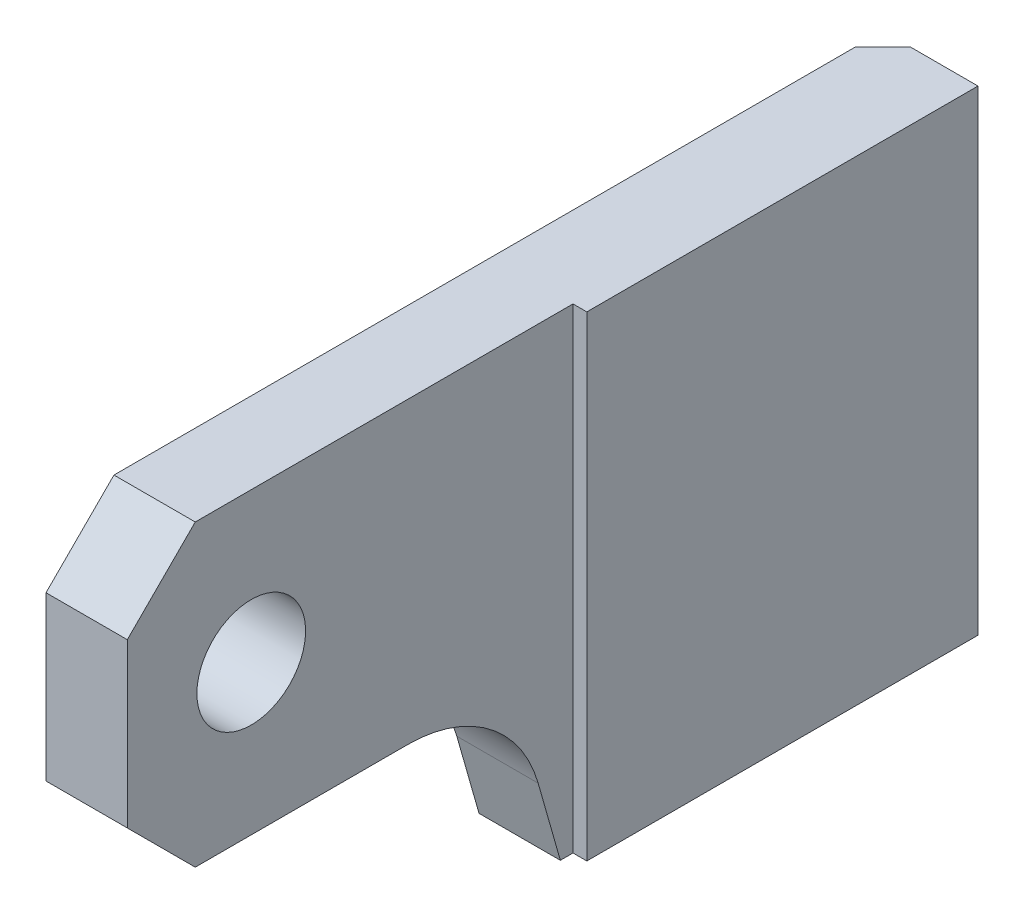
ISO-10303-21;
HEADER;
FILE_DESCRIPTION(('STEP AP214'),'2;1');
FILE_NAME('part.step','',(''),(''),'','','');
FILE_SCHEMA(('AUTOMOTIVE_DESIGN { 1 0 10303 214 1 1 1 1 }'));
ENDSEC;
DATA;
#1=APPLICATION_CONTEXT('core data for automotive mechanical design processes');
#2=APPLICATION_PROTOCOL_DEFINITION('international standard','automotive_design',2000,#1);
#3=PRODUCT_CONTEXT('',#1,'mechanical');
#4=PRODUCT('Part','Part','',(#3));
#5=PRODUCT_RELATED_PRODUCT_CATEGORY('part','',(#4));
#6=PRODUCT_DEFINITION_FORMATION('','',#4);
#7=PRODUCT_DEFINITION_CONTEXT('part definition',#1,'design');
#8=PRODUCT_DEFINITION('design','',#6,#7);
#9=PRODUCT_DEFINITION_SHAPE('','',#8);
#10=(LENGTH_UNIT() NAMED_UNIT(*) SI_UNIT(.MILLI.,.METRE.));
#11=(NAMED_UNIT(*) PLANE_ANGLE_UNIT() SI_UNIT($,.RADIAN.));
#12=(NAMED_UNIT(*) SI_UNIT($,.STERADIAN.) SOLID_ANGLE_UNIT());
#13=UNCERTAINTY_MEASURE_WITH_UNIT(LENGTH_MEASURE(1.E-05),#10,'distance_accuracy_value','');
#14=(GEOMETRIC_REPRESENTATION_CONTEXT(3) GLOBAL_UNCERTAINTY_ASSIGNED_CONTEXT((#13)) GLOBAL_UNIT_ASSIGNED_CONTEXT((#10,
#11,#12)) REPRESENTATION_CONTEXT('',''));
#15=CARTESIAN_POINT('',(0.,0.,0.));
#16=DIRECTION('',(0.,0.,1.));
#17=DIRECTION('',(1.,0.,0.));
#18=AXIS2_PLACEMENT_3D('',#15,#16,#17);
#19=CARTESIAN_POINT('',(-7.,-0.888409732677494,-92.5393309223954));
#20=DIRECTION('',(0.,0.,-1.));
#21=DIRECTION('',(-1.,0.,0.));
#22=AXIS2_PLACEMENT_3D('',#19,#20,#21);
#23=PLANE('',#22);
#24=DIRECTION('',(1.,0.,0.));
#25=VECTOR('',#24,1.);
#26=CARTESIAN_POINT('',(-7.,-35.8884097326775,-92.5393309223954));
#27=LINE('',#26,#25);
#28=CARTESIAN_POINT('',(-5.,-35.8884097326775,-92.5393309223954));
#29=VERTEX_POINT('',#28);
#30=CARTESIAN_POINT('',(0.,-35.8884097326775,-92.5393309223954));
#31=VERTEX_POINT('',#30);
#32=EDGE_CURVE('E179',#29,#31,#27,.T.);
#33=ORIENTED_EDGE('',*,*,#32,.F.);
#34=DIRECTION('',(0.,1.,0.));
#35=VECTOR('',#34,1.);
#36=CARTESIAN_POINT('',(-5.,-0.888409732677494,-92.5393309223954));
#37=LINE('',#36,#35);
#38=CARTESIAN_POINT('',(-5.,-0.888409732677494,-92.5393309223954));
#39=VERTEX_POINT('',#38);
#40=EDGE_CURVE('E207',#29,#39,#37,.T.);
#41=ORIENTED_EDGE('',*,*,#40,.T.);
#42=DIRECTION('',(1.,0.,0.));
#43=VECTOR('',#42,1.);
#44=CARTESIAN_POINT('',(-7.,-0.888409732677494,-92.5393309223954));
#45=LINE('',#44,#43);
#46=CARTESIAN_POINT('',(0.,-0.888409732677494,-92.5393309223954));
#47=VERTEX_POINT('',#46);
#48=EDGE_CURVE('E173',#39,#47,#45,.T.);
#49=ORIENTED_EDGE('',*,*,#48,.T.);
#50=DIRECTION('',(0.,1.,0.));
#51=VECTOR('',#50,1.);
#52=CARTESIAN_POINT('',(0.,-0.888409732677494,-92.5393309223954));
#53=LINE('',#52,#51);
#54=EDGE_CURVE('E160',#31,#47,#53,.T.);
#55=ORIENTED_EDGE('',*,*,#54,.F.);
#56=EDGE_LOOP('',(#33,#41,#49,#55));
#57=FACE_BOUND('',#56,.T.);
#58=ADVANCED_FACE('F32',(#57),#23,.T.);
#59=CARTESIAN_POINT('',(-7.,-35.8829238051351,-62.8226559338242));
#60=DIRECTION('',(0.,-0.999999982959996,0.00018460771439066));
#61=DIRECTION('',(0.,-0.00018460771439066,-0.999999982959996));
#62=AXIS2_PLACEMENT_3D('',#59,#60,#61);
#63=PLANE('',#62);
#64=DIRECTION('',(0.,-0.00018460771439066,-0.999999982959996));
#65=VECTOR('',#64,1.);
#66=CARTESIAN_POINT('',(-1.0169131466119,-35.8829238051351,-62.8226559338242));
#67=LINE('',#66,#65);
#68=CARTESIAN_POINT('',(-1.0169131466119,-35.8829238051351,-62.8226559338242));
#69=VERTEX_POINT('',#68);
#70=CARTESIAN_POINT('',(-1.0169131466119,-35.8830956643258,-63.7535985453471));
#71=VERTEX_POINT('',#70);
#72=EDGE_CURVE('E138',#69,#71,#67,.T.);
#73=ORIENTED_EDGE('',*,*,#72,.F.);
#74=DIRECTION('',(1.,0.,0.));
#75=VECTOR('',#74,1.);
#76=CARTESIAN_POINT('',(-7.,-35.8829238051351,-62.8226559338242));
#77=LINE('',#76,#75);
#78=CARTESIAN_POINT('',(-7.,-35.8829238051351,-62.8226559338242));
#79=VERTEX_POINT('',#78);
#80=EDGE_CURVE('E183',#79,#69,#77,.T.);
#81=ORIENTED_EDGE('',*,*,#80,.F.);
#82=DIRECTION('',(0.,-0.00018460771439066,-0.999999982959996));
#83=VECTOR('',#82,1.);
#84=CARTESIAN_POINT('',(-7.,-35.8829238051351,-62.8226559338242));
#85=LINE('',#84,#83);
#86=CARTESIAN_POINT('',(-7.,-35.8880405172424,-90.5393309223954));
#87=VERTEX_POINT('',#86);
#88=EDGE_CURVE('E171',#79,#87,#85,.T.);
#89=ORIENTED_EDGE('',*,*,#88,.T.);
#90=DIRECTION('',(-0.707106775161996,0.000130537367817164,0.707106775161996));
#91=VECTOR('',#90,1.);
#92=CARTESIAN_POINT('',(-20.8583377304318,-35.8854821611452,-76.6809931919637));
#93=LINE('',#92,#91);
#94=EDGE_CURVE('E213',#87,#29,#93,.F.);
#95=ORIENTED_EDGE('',*,*,#94,.T.);
#96=ORIENTED_EDGE('',*,*,#32,.T.);
#97=DIRECTION('',(0.,-0.00018460771439066,-0.999999982959996));
#98=VECTOR('',#97,1.);
#99=CARTESIAN_POINT('',(0.,-35.8829238051351,-62.8226559338242));
#100=LINE('',#99,#98);
#101=CARTESIAN_POINT('',(0.,-35.8830956643258,-63.7535985453471));
#102=VERTEX_POINT('',#101);
#103=EDGE_CURVE('E164',#102,#31,#100,.T.);
#104=ORIENTED_EDGE('',*,*,#103,.F.);
#105=DIRECTION('',(1.,0.,0.));
#106=VECTOR('',#105,1.);
#107=CARTESIAN_POINT('',(-7.,-35.8830956643258,-63.7535985453471));
#108=LINE('',#107,#106);
#109=EDGE_CURVE('E158',#71,#102,#108,.T.);
#110=ORIENTED_EDGE('',*,*,#109,.F.);
#111=EDGE_LOOP('',(#73,#81,#89,#95,#96,#104,#110));
#112=FACE_BOUND('',#111,.T.);
#113=ADVANCED_FACE('F238',(#112),#63,.T.);
#114=CARTESIAN_POINT('',(-7.,-35.8829238051351,-62.8226559338242));
#115=DIRECTION('',(0.,-0.274031633317628,0.961720678753074));
#116=DIRECTION('',(0.,-0.961720678753074,-0.274031633317628));
#117=AXIS2_PLACEMENT_3D('',#114,#115,#116);
#118=PLANE('',#117);
#119=DIRECTION('',(0.,-0.961720678753074,-0.274031633317628));
#120=VECTOR('',#119,1.);
#121=CARTESIAN_POINT('',(-1.0169131466119,-35.8829238051351,-62.8226559338242));
#122=LINE('',#121,#120);
#123=CARTESIAN_POINT('',(-1.0169131466119,-30.1480933995012,-61.1885796603546));
#124=VERTEX_POINT('',#123);
#125=EDGE_CURVE('E155',#124,#69,#122,.T.);
#126=ORIENTED_EDGE('',*,*,#125,.F.);
#127=DIRECTION('',(1.,0.,0.));
#128=VECTOR('',#127,1.);
#129=CARTESIAN_POINT('',(-7.,-30.1480933995012,-61.1885796603546));
#130=LINE('',#129,#128);
#131=CARTESIAN_POINT('',(-7.,-30.1480933995012,-61.1885796603546));
#132=VERTEX_POINT('',#131);
#133=EDGE_CURVE('E189',#124,#132,#130,.F.);
#134=ORIENTED_EDGE('',*,*,#133,.T.);
#135=DIRECTION('',(0.,-0.961720678753074,-0.274031633317628));
#136=VECTOR('',#135,1.);
#137=CARTESIAN_POINT('',(-7.,-35.8829238051351,-62.8226559338242));
#138=LINE('',#137,#136);
#139=EDGE_CURVE('E169',#132,#79,#138,.T.);
#140=ORIENTED_EDGE('',*,*,#139,.T.);
#141=ORIENTED_EDGE('',*,*,#80,.T.);
#142=EDGE_LOOP('',(#126,#134,#140,#141));
#143=FACE_BOUND('',#142,.T.);
#144=ADVANCED_FACE('F248',(#143),#118,.T.);
#145=CARTESIAN_POINT('',(-7.,-22.8884097326775,-59.1200133743844));
#146=DIRECTION('',(0.,-1.,0.));
#147=DIRECTION('',(0.,0.,-1.));
#148=AXIS2_PLACEMENT_3D('',#145,#146,#147);
#149=PLANE('',#148);
#150=DIRECTION('',(0.,0.,-1.));
#151=VECTOR('',#150,1.);
#152=CARTESIAN_POINT('',(-1.0169131466119,-22.8884097326775,-59.1200133743844));
#153=LINE('',#152,#151);
#154=CARTESIAN_POINT('',(-1.0169131466119,-22.8884097326775,-35.9567314021822));
#155=VERTEX_POINT('',#154);
#156=CARTESIAN_POINT('',(-1.0169131466119,-22.8884097326775,-51.5713728728239));
#157=VERTEX_POINT('',#156);
#158=EDGE_CURVE('E148',#155,#157,#153,.T.);
#159=ORIENTED_EDGE('',*,*,#158,.F.);
#160=DIRECTION('',(-1.,0.,0.));
#161=VECTOR('',#160,1.);
#162=CARTESIAN_POINT('',(-7.,-22.8884097326775,-35.9567314021822));
#163=LINE('',#162,#161);
#164=CARTESIAN_POINT('',(-7.,-22.8884097326775,-35.9567314021822));
#165=VERTEX_POINT('',#164);
#166=EDGE_CURVE('E205',#155,#165,#163,.T.);
#167=ORIENTED_EDGE('',*,*,#166,.T.);
#168=DIRECTION('',(0.,0.,-1.));
#169=VECTOR('',#168,1.);
#170=CARTESIAN_POINT('',(-7.,-22.8884097326775,-59.1200133743844));
#171=LINE('',#170,#169);
#172=CARTESIAN_POINT('',(-7.,-22.8884097326775,-51.5713728728239));
#173=VERTEX_POINT('',#172);
#174=EDGE_CURVE('E167',#165,#173,#171,.T.);
#175=ORIENTED_EDGE('',*,*,#174,.T.);
#176=DIRECTION('',(1.,0.,0.));
#177=VECTOR('',#176,1.);
#178=CARTESIAN_POINT('',(0.,-22.8884097326775,-51.5713728728239));
#179=LINE('',#178,#177);
#180=EDGE_CURVE('E182',#173,#157,#179,.T.);
#181=ORIENTED_EDGE('',*,*,#180,.T.);
#182=EDGE_LOOP('',(#159,#167,#175,#181));
#183=FACE_BOUND('',#182,.T.);
#184=ADVANCED_FACE('F220',(#183),#149,.T.);
#185=CARTESIAN_POINT('',(-7.,-0.888409732677494,-30.9567314021821));
#186=DIRECTION('',(0.,0.,1.));
#187=DIRECTION('',(0.,-1.,0.));
#188=AXIS2_PLACEMENT_3D('',#185,#186,#187);
#189=PLANE('',#188);
#190=DIRECTION('',(0.,-1.,0.));
#191=VECTOR('',#190,1.);
#192=CARTESIAN_POINT('',(-1.0169131466119,-0.888409732677494,-30.9567314021821));
#193=LINE('',#192,#191);
#194=CARTESIAN_POINT('',(-1.0169131466119,-5.8884097326775,-30.9567314021821));
#195=VERTEX_POINT('',#194);
#196=CARTESIAN_POINT('',(-1.0169131466119,-17.8884097326775,-30.9567314021821));
#197=VERTEX_POINT('',#196);
#198=EDGE_CURVE('E48',#195,#197,#193,.T.);
#199=ORIENTED_EDGE('',*,*,#198,.F.);
#200=DIRECTION('',(-1.,0.,0.));
#201=VECTOR('',#200,1.);
#202=CARTESIAN_POINT('',(-7.,-5.8884097326775,-30.9567314021821));
#203=LINE('',#202,#201);
#204=CARTESIAN_POINT('',(-7.,-5.88840973267751,-30.9567314021821));
#205=VERTEX_POINT('',#204);
#206=EDGE_CURVE('E198',#195,#205,#203,.T.);
#207=ORIENTED_EDGE('',*,*,#206,.T.);
#208=DIRECTION('',(0.,-1.,0.));
#209=VECTOR('',#208,1.);
#210=CARTESIAN_POINT('',(-7.,-0.888409732677494,-30.9567314021821));
#211=LINE('',#210,#209);
#212=CARTESIAN_POINT('',(-7.,-17.8884097326775,-30.9567314021821));
#213=VERTEX_POINT('',#212);
#214=EDGE_CURVE('E163',#205,#213,#211,.T.);
#215=ORIENTED_EDGE('',*,*,#214,.T.);
#216=DIRECTION('',(1.,0.,0.));
#217=VECTOR('',#216,1.);
#218=CARTESIAN_POINT('',(-7.,-17.8884097326775,-30.9567314021821));
#219=LINE('',#218,#217);
#220=EDGE_CURVE('E195',#213,#197,#219,.T.);
#221=ORIENTED_EDGE('',*,*,#220,.T.);
#222=EDGE_LOOP('',(#199,#207,#215,#221));
#223=FACE_BOUND('',#222,.T.);
#224=ADVANCED_FACE('F229',(#223),#189,.T.);
#225=CARTESIAN_POINT('',(-7.,-0.888409732677494,-92.5393309223954));
#226=DIRECTION('',(0.,1.,0.));
#227=DIRECTION('',(0.,0.,1.));
#228=AXIS2_PLACEMENT_3D('',#225,#226,#227);
#229=PLANE('',#228);
#230=DIRECTION('',(0.,0.,1.));
#231=VECTOR('',#230,1.);
#232=CARTESIAN_POINT('',(-1.0169131466119,-0.888409732677494,-63.7535985453471));
#233=LINE('',#232,#231);
#234=CARTESIAN_POINT('',(-1.0169131466119,-0.888409732677494,-63.7535985453471));
#235=VERTEX_POINT('',#234);
#236=CARTESIAN_POINT('',(-1.0169131466119,-0.888409732677494,-35.9567314021821));
#237=VERTEX_POINT('',#236);
#238=EDGE_CURVE('E133',#235,#237,#233,.T.);
#239=ORIENTED_EDGE('',*,*,#238,.F.);
#240=DIRECTION('',(-1.,0.,0.));
#241=VECTOR('',#240,1.);
#242=CARTESIAN_POINT('',(21.3515537397198,-0.888409732677494,-63.7535985453471));
#243=LINE('',#242,#241);
#244=CARTESIAN_POINT('',(0.,-0.888409732677494,-63.7535985453471));
#245=VERTEX_POINT('',#244);
#246=EDGE_CURVE('E124',#245,#235,#243,.T.);
#247=ORIENTED_EDGE('',*,*,#246,.F.);
#248=DIRECTION('',(0.,0.,1.));
#249=VECTOR('',#248,1.);
#250=CARTESIAN_POINT('',(0.,-0.888409732677494,-92.5393309223954));
#251=LINE('',#250,#249);
#252=EDGE_CURVE('E176',#47,#245,#251,.T.);
#253=ORIENTED_EDGE('',*,*,#252,.F.);
#254=ORIENTED_EDGE('',*,*,#48,.F.);
#255=DIRECTION('',(0.707106781186548,0.,-0.707106781186548));
#256=VECTOR('',#255,1.);
#257=CARTESIAN_POINT('',(-6.,-0.888409732677494,-91.5393309223954));
#258=LINE('',#257,#256);
#259=CARTESIAN_POINT('',(-7.,-0.888409732677494,-90.5393309223954));
#260=VERTEX_POINT('',#259);
#261=EDGE_CURVE('E210',#39,#260,#258,.F.);
#262=ORIENTED_EDGE('',*,*,#261,.T.);
#263=DIRECTION('',(0.,0.,1.));
#264=VECTOR('',#263,1.);
#265=CARTESIAN_POINT('',(-7.,-0.888409732677494,-92.5393309223954));
#266=LINE('',#265,#264);
#267=CARTESIAN_POINT('',(-7.,-0.888409732677494,-35.9567314021821));
#268=VERTEX_POINT('',#267);
#269=EDGE_CURVE('E161',#260,#268,#266,.T.);
#270=ORIENTED_EDGE('',*,*,#269,.T.);
#271=DIRECTION('',(1.,0.,0.));
#272=VECTOR('',#271,1.);
#273=CARTESIAN_POINT('',(-7.,-0.888409732677494,-35.9567314021821));
#274=LINE('',#273,#272);
#275=EDGE_CURVE('E143',#268,#237,#274,.T.);
#276=ORIENTED_EDGE('',*,*,#275,.T.);
#277=EDGE_LOOP('',(#239,#247,#253,#254,#262,#270,#276));
#278=FACE_BOUND('',#277,.T.);
#279=ADVANCED_FACE('F141',(#278),#229,.T.);
#280=CARTESIAN_POINT('',(-7.,-22.8884097326775,-92.5393309223954));
#281=DIRECTION('',(-1.,0.,0.));
#282=DIRECTION('',(0.,0.,1.));
#283=AXIS2_PLACEMENT_3D('',#280,#281,#282);
#284=PLANE('',#283);
#285=CARTESIAN_POINT('',(-7.,-11.8884097326775,-40.0768526248783));
#286=DIRECTION('',(-1.,0.,0.));
#287=DIRECTION('',(0.,0.,1.));
#288=AXIS2_PLACEMENT_3D('',#285,#286,#287);
#289=CIRCLE('',#288,3.99999999959404);
#290=CARTESIAN_POINT('',(-7.,-11.8884097326775,-36.0768526252842));
#291=VERTEX_POINT('',#290);
#292=EDGE_CURVE('E293',#291,#291,#289,.T.);
#293=ORIENTED_EDGE('',*,*,#292,.F.);
#294=EDGE_LOOP('',(#293));
#295=FACE_BOUND('',#294,.T.);
#296=ORIENTED_EDGE('',*,*,#269,.F.);
#297=DIRECTION('',(0.,-1.,0.));
#298=VECTOR('',#297,1.);
#299=CARTESIAN_POINT('',(-7.,-22.8884097326775,-90.5393309223954));
#300=LINE('',#299,#298);
#301=EDGE_CURVE('E56',#260,#87,#300,.T.);
#302=ORIENTED_EDGE('',*,*,#301,.T.);
#303=ORIENTED_EDGE('',*,*,#88,.F.);
#304=ORIENTED_EDGE('',*,*,#139,.F.);
#305=CARTESIAN_POINT('',(-7.,-32.8884097326775,-51.5713728728239));
#306=DIRECTION('',(-1.,0.,0.));
#307=DIRECTION('',(0.,0.,1.));
#308=AXIS2_PLACEMENT_3D('',#305,#306,#307);
#309=CIRCLE('',#308,10.);
#310=EDGE_CURVE('E191',#132,#173,#309,.F.);
#311=ORIENTED_EDGE('',*,*,#310,.T.);
#312=ORIENTED_EDGE('',*,*,#174,.F.);
#313=DIRECTION('',(0.,-0.707106781186547,-0.707106781186548));
#314=VECTOR('',#313,1.);
#315=CARTESIAN_POINT('',(-7.,-51.1797094927841,-64.2480311622888));
#316=LINE('',#315,#314);
#317=EDGE_CURVE('E200',#165,#213,#316,.F.);
#318=ORIENTED_EDGE('',*,*,#317,.T.);
#319=ORIENTED_EDGE('',*,*,#214,.F.);
#320=DIRECTION('',(0.,-0.707106781186549,0.707106781186547));
#321=VECTOR('',#320,1.);
#322=CARTESIAN_POINT('',(-7.,16.4028900274291,-53.2480311622887));
#323=LINE('',#322,#321);
#324=EDGE_CURVE('E202',#205,#268,#323,.F.);
#325=ORIENTED_EDGE('',*,*,#324,.T.);
#326=EDGE_LOOP('',(#296,#302,#303,#304,#311,#312,#318,#319,#325));
#327=FACE_BOUND('',#326,.T.);
#328=ADVANCED_FACE('F226',(#295,#327),#284,.T.);
#329=CARTESIAN_POINT('',(0.,-22.8884097326775,-92.5393309223954));
#330=DIRECTION('',(-1.,0.,0.));
#331=DIRECTION('',(0.,0.,1.));
#332=AXIS2_PLACEMENT_3D('',#329,#330,#331);
#333=PLANE('',#332);
#334=ORIENTED_EDGE('',*,*,#252,.T.);
#335=DIRECTION('',(0.,-1.,0.));
#336=VECTOR('',#335,1.);
#337=CARTESIAN_POINT('',(0.,-22.8884097326775,-63.7535985453471));
#338=LINE('',#337,#336);
#339=EDGE_CURVE('E11',#245,#102,#338,.T.);
#340=ORIENTED_EDGE('',*,*,#339,.T.);
#341=ORIENTED_EDGE('',*,*,#103,.T.);
#342=ORIENTED_EDGE('',*,*,#54,.T.);
#343=EDGE_LOOP('',(#334,#340,#341,#342));
#344=FACE_BOUND('',#343,.T.);
#345=ADVANCED_FACE('F245',(#344),#333,.F.);
#346=CARTESIAN_POINT('',(-7.,-32.8884097326775,-51.5713728728239));
#347=DIRECTION('',(-1.,0.,0.));
#348=DIRECTION('',(0.,0.,1.));
#349=AXIS2_PLACEMENT_3D('',#346,#347,#348);
#350=CYLINDRICAL_SURFACE('',#349,10.);
#351=ORIENTED_EDGE('',*,*,#133,.F.);
#352=CARTESIAN_POINT('',(-1.0169131466119,-32.8884097326775,-51.5713728728239));
#353=DIRECTION('',(-1.,0.,0.));
#354=DIRECTION('',(0.,0.,1.));
#355=AXIS2_PLACEMENT_3D('',#352,#353,#354);
#356=CIRCLE('',#355,10.);
#357=EDGE_CURVE('E152',#124,#157,#356,.F.);
#358=ORIENTED_EDGE('',*,*,#357,.T.);
#359=ORIENTED_EDGE('',*,*,#180,.F.);
#360=ORIENTED_EDGE('',*,*,#310,.F.);
#361=EDGE_LOOP('',(#351,#358,#359,#360));
#362=FACE_BOUND('',#361,.T.);
#363=ADVANCED_FACE('F253',(#362),#350,.F.);
#364=CARTESIAN_POINT('',(-7.,-0.888409732677494,-35.9567314021821));
#365=DIRECTION('',(0.,-0.707106781186546,-0.707106781186548));
#366=DIRECTION('',(0.,0.707106781186549,-0.707106781186547));
#367=AXIS2_PLACEMENT_3D('',#364,#365,#366);
#368=PLANE('',#367);
#369=DIRECTION('',(0.,0.707106781186549,-0.707106781186547));
#370=VECTOR('',#369,1.);
#371=CARTESIAN_POINT('',(-1.0169131466119,-0.888409732677494,-35.9567314021821));
#372=LINE('',#371,#370);
#373=EDGE_CURVE('E150',#237,#195,#372,.F.);
#374=ORIENTED_EDGE('',*,*,#373,.F.);
#375=ORIENTED_EDGE('',*,*,#275,.F.);
#376=ORIENTED_EDGE('',*,*,#324,.F.);
#377=ORIENTED_EDGE('',*,*,#206,.F.);
#378=EDGE_LOOP('',(#374,#375,#376,#377));
#379=FACE_BOUND('',#378,.T.);
#380=ADVANCED_FACE('F232',(#379),#368,.F.);
#381=CARTESIAN_POINT('',(-7.,-17.8884097326775,-30.9567314021821));
#382=DIRECTION('',(0.,0.707106781186548,-0.707106781186547));
#383=DIRECTION('',(0.,0.707106781186547,0.707106781186548));
#384=AXIS2_PLACEMENT_3D('',#381,#382,#383);
#385=PLANE('',#384);
#386=DIRECTION('',(0.,0.707106781186547,0.707106781186548));
#387=VECTOR('',#386,1.);
#388=CARTESIAN_POINT('',(-1.0169131466119,-17.8884097326775,-30.9567314021821));
#389=LINE('',#388,#387);
#390=EDGE_CURVE('E41',#197,#155,#389,.F.);
#391=ORIENTED_EDGE('',*,*,#390,.F.);
#392=ORIENTED_EDGE('',*,*,#220,.F.);
#393=ORIENTED_EDGE('',*,*,#317,.F.);
#394=ORIENTED_EDGE('',*,*,#166,.F.);
#395=EDGE_LOOP('',(#391,#392,#393,#394));
#396=FACE_BOUND('',#395,.T.);
#397=ADVANCED_FACE('F224',(#396),#385,.F.);
#398=CARTESIAN_POINT('',(-5.,-0.888409732677494,-92.5393309223954));
#399=DIRECTION('',(0.707106781186547,0.,0.707106781186547));
#400=DIRECTION('',(0.707106781186548,0.,-0.707106781186548));
#401=AXIS2_PLACEMENT_3D('',#398,#399,#400);
#402=PLANE('',#401);
#403=ORIENTED_EDGE('',*,*,#94,.F.);
#404=ORIENTED_EDGE('',*,*,#301,.F.);
#405=ORIENTED_EDGE('',*,*,#261,.F.);
#406=ORIENTED_EDGE('',*,*,#40,.F.);
#407=EDGE_LOOP('',(#403,#404,#405,#406));
#408=FACE_BOUND('',#407,.T.);
#409=ADVANCED_FACE('F34',(#408),#402,.F.);
#410=CARTESIAN_POINT('',(-1.0169131466119,-35.8884097326775,-63.7535985453471));
#411=DIRECTION('',(-1.,0.,0.));
#412=DIRECTION('',(0.,0.,1.));
#413=AXIS2_PLACEMENT_3D('',#410,#411,#412);
#414=PLANE('',#413);
#415=CARTESIAN_POINT('',(-1.0169131466119,-11.8884097326775,-40.0768526248783));
#416=DIRECTION('',(-1.,0.,0.));
#417=DIRECTION('',(0.,0.,1.));
#418=AXIS2_PLACEMENT_3D('',#415,#416,#417);
#419=CIRCLE('',#418,3.99999999959404);
#420=CARTESIAN_POINT('',(-1.0169131466119,-11.8884097326775,-36.0768526252842));
#421=VERTEX_POINT('',#420);
#422=EDGE_CURVE('E36',#421,#421,#419,.T.);
#423=ORIENTED_EDGE('',*,*,#422,.T.);
#424=EDGE_LOOP('',(#423));
#425=FACE_BOUND('',#424,.T.);
#426=ORIENTED_EDGE('',*,*,#72,.T.);
#427=DIRECTION('',(0.,1.,0.));
#428=VECTOR('',#427,1.);
#429=CARTESIAN_POINT('',(-1.0169131466119,-35.8884097326775,-63.7535985453471));
#430=LINE('',#429,#428);
#431=EDGE_CURVE('E127',#71,#235,#430,.T.);
#432=ORIENTED_EDGE('',*,*,#431,.T.);
#433=ORIENTED_EDGE('',*,*,#238,.T.);
#434=ORIENTED_EDGE('',*,*,#373,.T.);
#435=ORIENTED_EDGE('',*,*,#198,.T.);
#436=ORIENTED_EDGE('',*,*,#390,.T.);
#437=ORIENTED_EDGE('',*,*,#158,.T.);
#438=ORIENTED_EDGE('',*,*,#357,.F.);
#439=ORIENTED_EDGE('',*,*,#125,.T.);
#440=EDGE_LOOP('',(#426,#432,#433,#434,#435,#436,#437,#438,#439));
#441=FACE_BOUND('',#440,.T.);
#442=ADVANCED_FACE('F135',(#425,#441),#414,.F.);
#443=CARTESIAN_POINT('',(21.3515537397198,-35.8884097326775,-63.7535985453471));
#444=DIRECTION('',(0.,0.,-1.));
#445=DIRECTION('',(-1.,0.,0.));
#446=AXIS2_PLACEMENT_3D('',#443,#444,#445);
#447=PLANE('',#446);
#448=ORIENTED_EDGE('',*,*,#109,.T.);
#449=ORIENTED_EDGE('',*,*,#339,.F.);
#450=ORIENTED_EDGE('',*,*,#246,.T.);
#451=ORIENTED_EDGE('',*,*,#431,.F.);
#452=EDGE_LOOP('',(#448,#449,#450,#451));
#453=FACE_BOUND('',#452,.T.);
#454=ADVANCED_FACE('F126',(#453),#447,.F.);
#455=CARTESIAN_POINT('',(0.,-11.8884097326775,-40.0768526248783));
#456=DIRECTION('',(-1.,0.,0.));
#457=DIRECTION('',(0.,0.,1.));
#458=AXIS2_PLACEMENT_3D('',#455,#456,#457);
#459=CYLINDRICAL_SURFACE('',#458,3.99999999959404);
#460=ORIENTED_EDGE('',*,*,#292,.T.);
#461=EDGE_LOOP('',(#460));
#462=FACE_BOUND('',#461,.T.);
#463=ORIENTED_EDGE('',*,*,#422,.F.);
#464=EDGE_LOOP('',(#463));
#465=FACE_BOUND('',#464,.T.);
#466=ADVANCED_FACE('F282',(#462,#465),#459,.F.);
#467=CLOSED_SHELL('',(#58,#113,#144,#184,#224,#279,#328,#345,#363,#380,#397,#409,#442,#454,#466));
#468=MANIFOLD_SOLID_BREP('B2',#467);
#469=ADVANCED_BREP_SHAPE_REPRESENTATION('',(#18,#468),#14);
#470=SHAPE_DEFINITION_REPRESENTATION(#9,#469);
ENDSEC;
END-ISO-10303-21;
